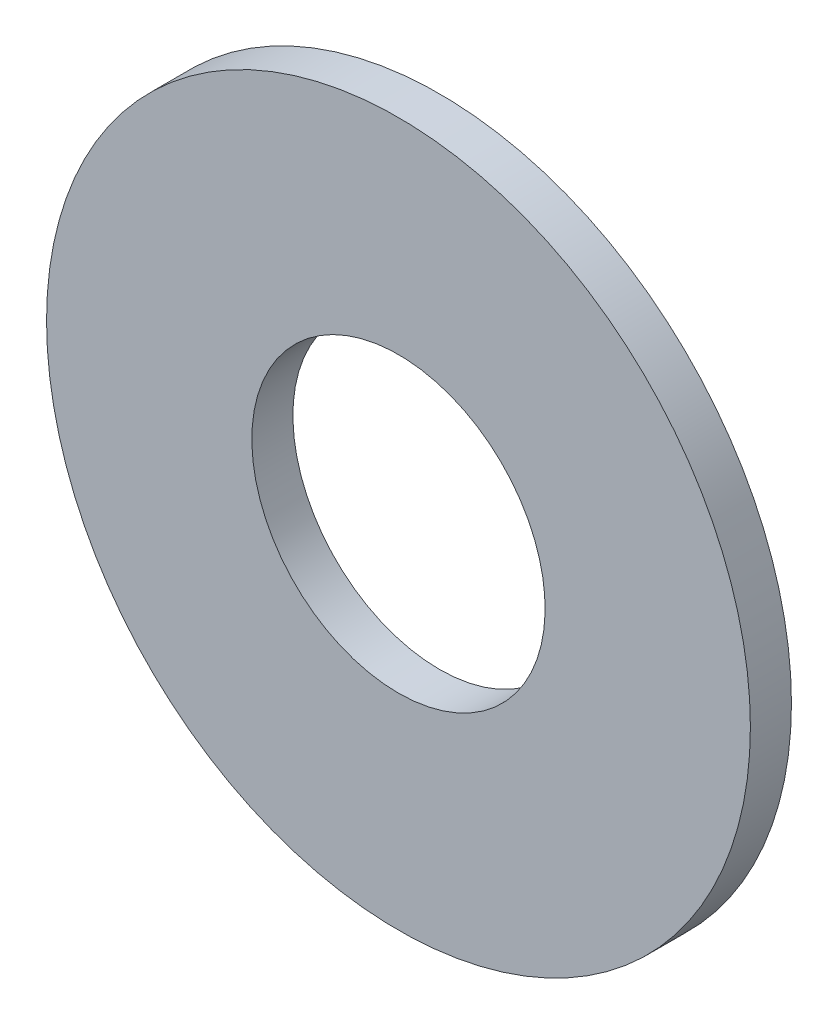
ISO-10303-21;
HEADER;
FILE_DESCRIPTION(('STEP AP214'),'2;1');
FILE_NAME('part.step','',(''),(''),'','','');
FILE_SCHEMA(('AUTOMOTIVE_DESIGN { 1 0 10303 214 1 1 1 1 }'));
ENDSEC;
DATA;
#1=APPLICATION_CONTEXT('core data for automotive mechanical design processes');
#2=APPLICATION_PROTOCOL_DEFINITION('international standard','automotive_design',2000,#1);
#3=PRODUCT_CONTEXT('',#1,'mechanical');
#4=PRODUCT('Part','Part','',(#3));
#5=PRODUCT_RELATED_PRODUCT_CATEGORY('part','',(#4));
#6=PRODUCT_DEFINITION_FORMATION('','',#4);
#7=PRODUCT_DEFINITION_CONTEXT('part definition',#1,'design');
#8=PRODUCT_DEFINITION('design','',#6,#7);
#9=PRODUCT_DEFINITION_SHAPE('','',#8);
#10=(LENGTH_UNIT() NAMED_UNIT(*) SI_UNIT(.MILLI.,.METRE.));
#11=(NAMED_UNIT(*) PLANE_ANGLE_UNIT() SI_UNIT($,.RADIAN.));
#12=(NAMED_UNIT(*) SI_UNIT($,.STERADIAN.) SOLID_ANGLE_UNIT());
#13=UNCERTAINTY_MEASURE_WITH_UNIT(LENGTH_MEASURE(1.E-05),#10,'distance_accuracy_value','');
#14=(GEOMETRIC_REPRESENTATION_CONTEXT(3) GLOBAL_UNCERTAINTY_ASSIGNED_CONTEXT((#13)) GLOBAL_UNIT_ASSIGNED_CONTEXT((#10,
#11,#12)) REPRESENTATION_CONTEXT('',''));
#15=CARTESIAN_POINT('',(0.,0.,0.));
#16=DIRECTION('',(0.,0.,1.));
#17=DIRECTION('',(1.,0.,0.));
#18=AXIS2_PLACEMENT_3D('',#15,#16,#17);
#19=CARTESIAN_POINT('',(124.14,-112.85,-0.045));
#20=DIRECTION('',(0.,0.,-1.));
#21=DIRECTION('',(0.,-1.,0.));
#22=AXIS2_PLACEMENT_3D('',#19,#20,#21);
#23=CYLINDRICAL_SURFACE('',#22,0.125);
#24=CARTESIAN_POINT('',(124.14,-112.85,-0.035));
#25=DIRECTION('',(0.,0.,-1.));
#26=DIRECTION('',(0.,-1.,0.));
#27=AXIS2_PLACEMENT_3D('',#24,#25,#26);
#28=CIRCLE('',#27,0.125);
#29=CARTESIAN_POINT('',(124.14,-112.975,-0.035));
#30=VERTEX_POINT('',#29);
#31=EDGE_CURVE('E25',#30,#30,#28,.T.);
#32=ORIENTED_EDGE('',*,*,#31,.T.);
#33=DIRECTION('',(0.,0.,1.));
#34=VECTOR('',#33,1.);
#35=CARTESIAN_POINT('',(124.14,-112.975,-0.045));
#36=LINE('',#35,#34);
#37=CARTESIAN_POINT('',(124.14,-112.975,0.));
#38=VERTEX_POINT('',#37);
#39=EDGE_CURVE('E11',#30,#38,#36,.T.);
#40=ORIENTED_EDGE('',*,*,#39,.T.);
#41=CARTESIAN_POINT('',(124.14,-112.85,0.));
#42=DIRECTION('',(0.,0.,-1.));
#43=DIRECTION('',(0.,-1.,0.));
#44=AXIS2_PLACEMENT_3D('',#41,#42,#43);
#45=CIRCLE('',#44,0.125);
#46=EDGE_CURVE('E69',#38,#38,#45,.T.);
#47=ORIENTED_EDGE('',*,*,#46,.F.);
#48=ORIENTED_EDGE('',*,*,#39,.F.);
#49=EDGE_LOOP('',(#32,#40,#47,#48));
#50=FACE_BOUND('',#49,.T.);
#51=ADVANCED_FACE('F17',(#50),#23,.F.);
#52=CARTESIAN_POINT('',(124.14,-112.85,-0.035));
#53=DIRECTION('',(0.,0.,1.));
#54=DIRECTION('',(1.,0.,0.));
#55=AXIS2_PLACEMENT_3D('',#52,#53,#54);
#56=PLANE('',#55);
#57=ORIENTED_EDGE('',*,*,#31,.F.);
#58=EDGE_LOOP('',(#57));
#59=FACE_BOUND('',#58,.T.);
#60=CARTESIAN_POINT('',(124.14,-112.85,-0.035));
#61=DIRECTION('',(0.,0.,1.));
#62=DIRECTION('',(1.,0.,0.));
#63=AXIS2_PLACEMENT_3D('',#60,#61,#62);
#64=CIRCLE('',#63,0.3);
#65=CARTESIAN_POINT('',(124.44,-112.85,-0.035));
#66=VERTEX_POINT('',#65);
#67=EDGE_CURVE('E56',#66,#66,#64,.T.);
#68=ORIENTED_EDGE('',*,*,#67,.F.);
#69=EDGE_LOOP('',(#68));
#70=FACE_BOUND('',#69,.T.);
#71=ADVANCED_FACE('F76',(#59,#70),#56,.F.);
#72=CARTESIAN_POINT('',(124.14,-112.85,0.));
#73=DIRECTION('',(0.,0.,1.));
#74=DIRECTION('',(1.,0.,0.));
#75=AXIS2_PLACEMENT_3D('',#72,#73,#74);
#76=PLANE('',#75);
#77=ORIENTED_EDGE('',*,*,#46,.T.);
#78=EDGE_LOOP('',(#77));
#79=FACE_BOUND('',#78,.T.);
#80=CARTESIAN_POINT('',(124.14,-112.85,0.));
#81=DIRECTION('',(0.,0.,1.));
#82=DIRECTION('',(1.,0.,0.));
#83=AXIS2_PLACEMENT_3D('',#80,#81,#82);
#84=CIRCLE('',#83,0.3);
#85=CARTESIAN_POINT('',(124.44,-112.85,0.));
#86=VERTEX_POINT('',#85);
#87=EDGE_CURVE('E54',#86,#86,#84,.T.);
#88=ORIENTED_EDGE('',*,*,#87,.T.);
#89=EDGE_LOOP('',(#88));
#90=FACE_BOUND('',#89,.T.);
#91=ADVANCED_FACE('F60',(#79,#90),#76,.T.);
#92=CARTESIAN_POINT('',(124.14,-112.85,-0.035));
#93=DIRECTION('',(0.,0.,1.));
#94=DIRECTION('',(1.,0.,0.));
#95=AXIS2_PLACEMENT_3D('',#92,#93,#94);
#96=CYLINDRICAL_SURFACE('',#95,0.3);
#97=ORIENTED_EDGE('',*,*,#87,.F.);
#98=DIRECTION('',(0.,0.,1.));
#99=VECTOR('',#98,1.);
#100=CARTESIAN_POINT('',(124.44,-112.85,-0.035));
#101=LINE('',#100,#99);
#102=EDGE_CURVE('E51',#66,#86,#101,.T.);
#103=ORIENTED_EDGE('',*,*,#102,.F.);
#104=ORIENTED_EDGE('',*,*,#67,.T.);
#105=ORIENTED_EDGE('',*,*,#102,.T.);
#106=EDGE_LOOP('',(#97,#103,#104,#105));
#107=FACE_BOUND('',#106,.T.);
#108=ADVANCED_FACE('F53',(#107),#96,.T.);
#109=CLOSED_SHELL('',(#51,#71,#91,#108));
#110=MANIFOLD_SOLID_BREP('B1',#109);
#111=ADVANCED_BREP_SHAPE_REPRESENTATION('',(#18,#110),#14);
#112=SHAPE_DEFINITION_REPRESENTATION(#9,#111);
ENDSEC;
END-ISO-10303-21;
